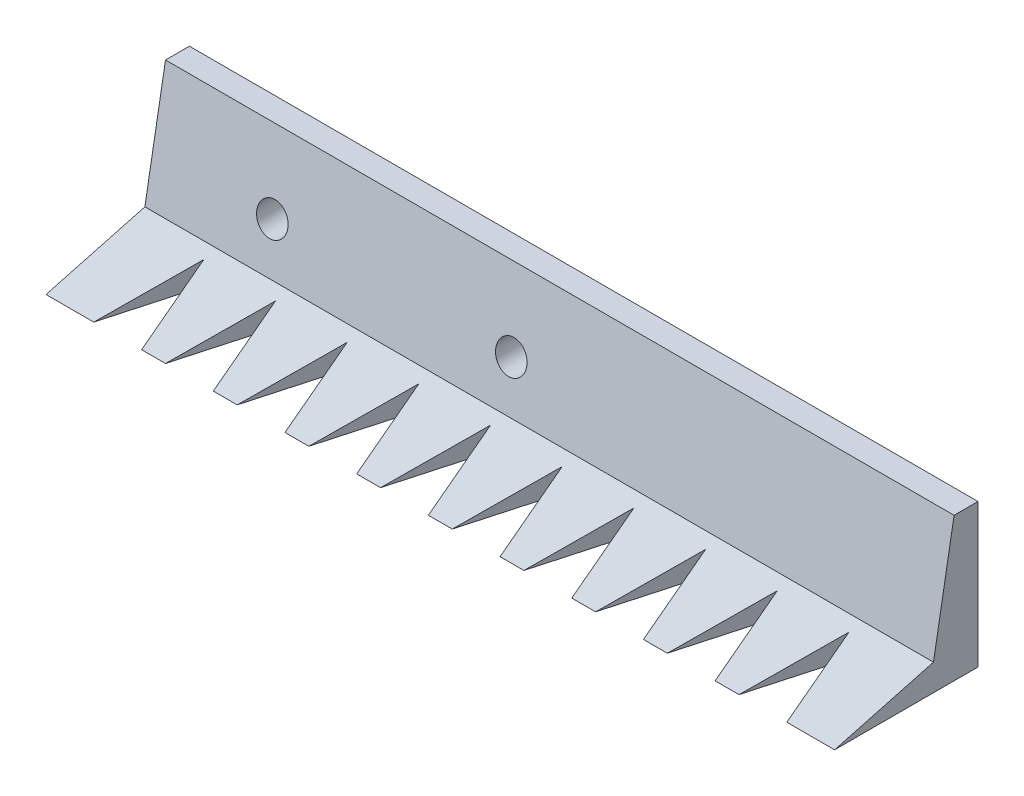
ISO-10303-21;
HEADER;
FILE_DESCRIPTION(('STEP AP214'),'2;1');
FILE_NAME('part.step','',(''),(''),'','','');
FILE_SCHEMA(('AUTOMOTIVE_DESIGN { 1 0 10303 214 1 1 1 1 }'));
ENDSEC;
DATA;
#1=APPLICATION_CONTEXT('core data for automotive mechanical design processes');
#2=APPLICATION_PROTOCOL_DEFINITION('international standard','automotive_design',2000,#1);
#3=PRODUCT_CONTEXT('',#1,'mechanical');
#4=PRODUCT('Part','Part','',(#3));
#5=PRODUCT_RELATED_PRODUCT_CATEGORY('part','',(#4));
#6=PRODUCT_DEFINITION_FORMATION('','',#4);
#7=PRODUCT_DEFINITION_CONTEXT('part definition',#1,'design');
#8=PRODUCT_DEFINITION('design','',#6,#7);
#9=PRODUCT_DEFINITION_SHAPE('','',#8);
#10=(LENGTH_UNIT() NAMED_UNIT(*) SI_UNIT(.MILLI.,.METRE.));
#11=(NAMED_UNIT(*) PLANE_ANGLE_UNIT() SI_UNIT($,.RADIAN.));
#12=(NAMED_UNIT(*) SI_UNIT($,.STERADIAN.) SOLID_ANGLE_UNIT());
#13=UNCERTAINTY_MEASURE_WITH_UNIT(LENGTH_MEASURE(1.E-05),#10,'distance_accuracy_value','');
#14=(GEOMETRIC_REPRESENTATION_CONTEXT(3) GLOBAL_UNCERTAINTY_ASSIGNED_CONTEXT((#13)) GLOBAL_UNIT_ASSIGNED_CONTEXT((#10,
#11,#12)) REPRESENTATION_CONTEXT('',''));
#15=CARTESIAN_POINT('',(0.,0.,0.));
#16=DIRECTION('',(0.,0.,1.));
#17=DIRECTION('',(1.,0.,0.));
#18=AXIS2_PLACEMENT_3D('',#15,#16,#17);
#19=CARTESIAN_POINT('',(100.,0.,30.));
#20=DIRECTION('',(0.,1.,0.));
#21=DIRECTION('',(0.,0.,1.));
#22=AXIS2_PLACEMENT_3D('',#19,#20,#21);
#23=PLANE('',#22);
#24=DIRECTION('',(0.267643863786095,0.,0.963517909629941));
#25=VECTOR('',#24,1.);
#26=CARTESIAN_POINT('',(39.6561604584527,0.,46.7621776504298));
#27=LINE('',#26,#25);
#28=CARTESIAN_POINT('',(30.,0.,12.));
#29=VERTEX_POINT('',#28);
#30=CARTESIAN_POINT('',(35.,0.,30.));
#31=VERTEX_POINT('',#30);
#32=EDGE_CURVE('E266',#29,#31,#27,.T.);
#33=ORIENTED_EDGE('',*,*,#32,.F.);
#34=DIRECTION('',(0.267643863786095,0.,-0.963517909629941));
#35=VECTOR('',#34,1.);
#36=CARTESIAN_POINT('',(30.3724928366762,0.,10.6590257879656));
#37=LINE('',#36,#35);
#38=CARTESIAN_POINT('',(25.,0.,30.));
#39=VERTEX_POINT('',#38);
#40=EDGE_CURVE('E264',#39,#29,#37,.T.);
#41=ORIENTED_EDGE('',*,*,#40,.F.);
#42=DIRECTION('',(-1.,0.,0.));
#43=VECTOR('',#42,1.);
#44=CARTESIAN_POINT('',(100.,0.,30.));
#45=LINE('',#44,#43);
#46=CARTESIAN_POINT('',(20.,0.,30.));
#47=VERTEX_POINT('',#46);
#48=EDGE_CURVE('E320',#39,#47,#45,.T.);
#49=ORIENTED_EDGE('',*,*,#48,.T.);
#50=DIRECTION('',(0.267643863786095,0.,0.963517909629941));
#51=VECTOR('',#50,1.);
#52=CARTESIAN_POINT('',(25.730659025788,0.,50.6303724928367));
#53=LINE('',#52,#51);
#54=CARTESIAN_POINT('',(15.,0.,12.));
#55=VERTEX_POINT('',#54);
#56=EDGE_CURVE('E273',#55,#47,#53,.T.);
#57=ORIENTED_EDGE('',*,*,#56,.F.);
#58=DIRECTION('',(0.267643863786095,0.,-0.963517909629941));
#59=VECTOR('',#58,1.);
#60=CARTESIAN_POINT('',(16.4469914040114,0.,6.79083094555874));
#61=LINE('',#60,#59);
#62=CARTESIAN_POINT('',(10.,0.,30.));
#63=VERTEX_POINT('',#62);
#64=EDGE_CURVE('E271',#63,#55,#61,.T.);
#65=ORIENTED_EDGE('',*,*,#64,.F.);
#66=CARTESIAN_POINT('',(0.,0.,30.));
#67=VERTEX_POINT('',#66);
#68=EDGE_CURVE('E316',#63,#67,#45,.T.);
#69=ORIENTED_EDGE('',*,*,#68,.T.);
#70=DIRECTION('',(0.,0.,-1.));
#71=VECTOR('',#70,1.);
#72=CARTESIAN_POINT('',(0.,0.,30.));
#73=LINE('',#72,#71);
#74=CARTESIAN_POINT('',(0.,0.,0.));
#75=VERTEX_POINT('',#74);
#76=EDGE_CURVE('E304',#67,#75,#73,.T.);
#77=ORIENTED_EDGE('',*,*,#76,.T.);
#78=DIRECTION('',(-1.,0.,0.));
#79=VECTOR('',#78,1.);
#80=CARTESIAN_POINT('',(100.,0.,0.));
#81=LINE('',#80,#79);
#82=CARTESIAN_POINT('',(165.,0.,0.));
#83=VERTEX_POINT('',#82);
#84=EDGE_CURVE('E329',#83,#75,#81,.T.);
#85=ORIENTED_EDGE('',*,*,#84,.F.);
#86=DIRECTION('',(0.,0.,1.));
#87=VECTOR('',#86,1.);
#88=CARTESIAN_POINT('',(165.,0.,0.));
#89=LINE('',#88,#87);
#90=CARTESIAN_POINT('',(165.,0.,30.));
#91=VERTEX_POINT('',#90);
#92=EDGE_CURVE('E279',#83,#91,#89,.T.);
#93=ORIENTED_EDGE('',*,*,#92,.T.);
#94=CARTESIAN_POINT('',(155.,0.,30.));
#95=VERTEX_POINT('',#94);
#96=EDGE_CURVE('E233',#91,#95,#45,.T.);
#97=ORIENTED_EDGE('',*,*,#96,.T.);
#98=DIRECTION('',(0.267643863786095,0.,0.963517909629941));
#99=VECTOR('',#98,1.);
#100=CARTESIAN_POINT('',(151.060171919771,0.,15.8166189111748));
#101=LINE('',#100,#99);
#102=CARTESIAN_POINT('',(150.,0.,12.));
#103=VERTEX_POINT('',#102);
#104=EDGE_CURVE('E222',#103,#95,#101,.T.);
#105=ORIENTED_EDGE('',*,*,#104,.F.);
#106=DIRECTION('',(0.267643863786095,0.,-0.963517909629941));
#107=VECTOR('',#106,1.);
#108=CARTESIAN_POINT('',(141.776504297994,0.,41.6045845272206));
#109=LINE('',#108,#107);
#110=CARTESIAN_POINT('',(145.,0.,30.));
#111=VERTEX_POINT('',#110);
#112=EDGE_CURVE('E211',#111,#103,#109,.T.);
#113=ORIENTED_EDGE('',*,*,#112,.F.);
#114=CARTESIAN_POINT('',(140.,0.,30.));
#115=VERTEX_POINT('',#114);
#116=EDGE_CURVE('E319',#111,#115,#45,.T.);
#117=ORIENTED_EDGE('',*,*,#116,.T.);
#118=DIRECTION('',(0.267643863786095,0.,0.963517909629941));
#119=VECTOR('',#118,1.);
#120=CARTESIAN_POINT('',(137.134670487106,0.,19.6848137535817));
#121=LINE('',#120,#119);
#122=CARTESIAN_POINT('',(135.,0.,12.));
#123=VERTEX_POINT('',#122);
#124=EDGE_CURVE('E236',#123,#115,#121,.T.);
#125=ORIENTED_EDGE('',*,*,#124,.F.);
#126=DIRECTION('',(0.267643863786095,0.,-0.963517909629941));
#127=VECTOR('',#126,1.);
#128=CARTESIAN_POINT('',(127.85100286533,0.,37.7363896848138));
#129=LINE('',#128,#127);
#130=CARTESIAN_POINT('',(130.,0.,30.));
#131=VERTEX_POINT('',#130);
#132=EDGE_CURVE('E234',#131,#123,#129,.T.);
#133=ORIENTED_EDGE('',*,*,#132,.F.);
#134=CARTESIAN_POINT('',(125.,0.,30.));
#135=VERTEX_POINT('',#134);
#136=EDGE_CURVE('E397',#131,#135,#45,.T.);
#137=ORIENTED_EDGE('',*,*,#136,.T.);
#138=DIRECTION('',(0.267643863786095,0.,0.963517909629941));
#139=VECTOR('',#138,1.);
#140=CARTESIAN_POINT('',(123.209169054441,0.,23.5530085959885));
#141=LINE('',#140,#139);
#142=CARTESIAN_POINT('',(120.,0.,12.));
#143=VERTEX_POINT('',#142);
#144=EDGE_CURVE('E242',#143,#135,#141,.T.);
#145=ORIENTED_EDGE('',*,*,#144,.F.);
#146=DIRECTION('',(0.267643863786095,0.,-0.963517909629941));
#147=VECTOR('',#146,1.);
#148=CARTESIAN_POINT('',(113.925501432665,0.,33.8681948424069));
#149=LINE('',#148,#147);
#150=CARTESIAN_POINT('',(115.,0.,30.));
#151=VERTEX_POINT('',#150);
#152=EDGE_CURVE('E240',#151,#143,#149,.T.);
#153=ORIENTED_EDGE('',*,*,#152,.F.);
#154=CARTESIAN_POINT('',(110.,0.,30.));
#155=VERTEX_POINT('',#154);
#156=EDGE_CURVE('E400',#151,#155,#45,.T.);
#157=ORIENTED_EDGE('',*,*,#156,.T.);
#158=DIRECTION('',(0.267643863786095,0.,0.963517909629941));
#159=VECTOR('',#158,1.);
#160=CARTESIAN_POINT('',(109.283667621776,0.,27.4212034383954));
#161=LINE('',#160,#159);
#162=CARTESIAN_POINT('',(105.,0.,12.));
#163=VERTEX_POINT('',#162);
#164=EDGE_CURVE('E246',#163,#155,#161,.T.);
#165=ORIENTED_EDGE('',*,*,#164,.F.);
#166=DIRECTION('',(0.267643863786095,0.,-0.963517909629941));
#167=VECTOR('',#166,1.);
#168=CARTESIAN_POINT('',(100.,0.,30.));
#169=LINE('',#168,#167);
#170=CARTESIAN_POINT('',(100.,0.,30.));
#171=VERTEX_POINT('',#170);
#172=EDGE_CURVE('E244',#171,#163,#169,.T.);
#173=ORIENTED_EDGE('',*,*,#172,.F.);
#174=CARTESIAN_POINT('',(95.,0.,30.));
#175=VERTEX_POINT('',#174);
#176=EDGE_CURVE('E405',#171,#175,#45,.T.);
#177=ORIENTED_EDGE('',*,*,#176,.T.);
#178=DIRECTION('',(0.267643863786095,0.,0.963517909629941));
#179=VECTOR('',#178,1.);
#180=CARTESIAN_POINT('',(95.3581661891117,0.,31.2893982808023));
#181=LINE('',#180,#179);
#182=CARTESIAN_POINT('',(90.,0.,12.));
#183=VERTEX_POINT('',#182);
#184=EDGE_CURVE('E250',#183,#175,#181,.T.);
#185=ORIENTED_EDGE('',*,*,#184,.F.);
#186=DIRECTION('',(0.267643863786095,0.,-0.963517909629941));
#187=VECTOR('',#186,1.);
#188=CARTESIAN_POINT('',(86.0744985673352,0.,26.1318051575931));
#189=LINE('',#188,#187);
#190=CARTESIAN_POINT('',(85.,0.,30.));
#191=VERTEX_POINT('',#190);
#192=EDGE_CURVE('E248',#191,#183,#189,.T.);
#193=ORIENTED_EDGE('',*,*,#192,.F.);
#194=CARTESIAN_POINT('',(80.,0.,30.));
#195=VERTEX_POINT('',#194);
#196=EDGE_CURVE('E410',#191,#195,#45,.T.);
#197=ORIENTED_EDGE('',*,*,#196,.T.);
#198=DIRECTION('',(0.267643863786095,0.,0.963517909629941));
#199=VECTOR('',#198,1.);
#200=CARTESIAN_POINT('',(81.432664756447,0.,35.1575931232092));
#201=LINE('',#200,#199);
#202=CARTESIAN_POINT('',(75.,0.,12.));
#203=VERTEX_POINT('',#202);
#204=EDGE_CURVE('E254',#203,#195,#201,.T.);
#205=ORIENTED_EDGE('',*,*,#204,.F.);
#206=DIRECTION('',(0.267643863786095,0.,-0.963517909629941));
#207=VECTOR('',#206,1.);
#208=CARTESIAN_POINT('',(72.1489971346705,0.,22.2636103151862));
#209=LINE('',#208,#207);
#210=CARTESIAN_POINT('',(70.,0.,30.));
#211=VERTEX_POINT('',#210);
#212=EDGE_CURVE('E252',#211,#203,#209,.T.);
#213=ORIENTED_EDGE('',*,*,#212,.F.);
#214=CARTESIAN_POINT('',(65.,0.,30.));
#215=VERTEX_POINT('',#214);
#216=EDGE_CURVE('E415',#211,#215,#45,.T.);
#217=ORIENTED_EDGE('',*,*,#216,.T.);
#218=DIRECTION('',(0.267643863786095,0.,0.963517909629941));
#219=VECTOR('',#218,1.);
#220=CARTESIAN_POINT('',(67.5071633237822,0.,39.025787965616));
#221=LINE('',#220,#219);
#222=CARTESIAN_POINT('',(60.,0.,12.));
#223=VERTEX_POINT('',#222);
#224=EDGE_CURVE('E258',#223,#215,#221,.T.);
#225=ORIENTED_EDGE('',*,*,#224,.F.);
#226=DIRECTION('',(0.267643863786095,0.,-0.963517909629941));
#227=VECTOR('',#226,1.);
#228=CARTESIAN_POINT('',(58.2234957020057,0.,18.3954154727794));
#229=LINE('',#228,#227);
#230=CARTESIAN_POINT('',(55.,0.,30.));
#231=VERTEX_POINT('',#230);
#232=EDGE_CURVE('E256',#231,#223,#229,.T.);
#233=ORIENTED_EDGE('',*,*,#232,.F.);
#234=CARTESIAN_POINT('',(50.,0.,30.));
#235=VERTEX_POINT('',#234);
#236=EDGE_CURVE('E394',#231,#235,#45,.T.);
#237=ORIENTED_EDGE('',*,*,#236,.T.);
#238=DIRECTION('',(0.267643863786095,0.,0.963517909629941));
#239=VECTOR('',#238,1.);
#240=CARTESIAN_POINT('',(53.5816618911175,0.,42.8939828080229));
#241=LINE('',#240,#239);
#242=CARTESIAN_POINT('',(45.,0.,12.));
#243=VERTEX_POINT('',#242);
#244=EDGE_CURVE('E262',#243,#235,#241,.T.);
#245=ORIENTED_EDGE('',*,*,#244,.F.);
#246=DIRECTION('',(0.267643863786095,0.,-0.963517909629941));
#247=VECTOR('',#246,1.);
#248=CARTESIAN_POINT('',(44.297994269341,0.,14.5272206303725));
#249=LINE('',#248,#247);
#250=CARTESIAN_POINT('',(40.,0.,30.));
#251=VERTEX_POINT('',#250);
#252=EDGE_CURVE('E260',#251,#243,#249,.T.);
#253=ORIENTED_EDGE('',*,*,#252,.F.);
#254=EDGE_CURVE('E393',#251,#31,#45,.T.);
#255=ORIENTED_EDGE('',*,*,#254,.T.);
#256=EDGE_LOOP('',(#33,#41,#49,#57,#65,#69,#77,#85,#93,#97,#105,#113,#117,#125,#133,#137,#145,
#153,#157,#165,#173,#177,#185,#193,#197,#205,#213,#217,#225,#233,#237,#245,#253,#255));
#257=FACE_BOUND('',#256,.T.);
#258=ADVANCED_FACE('F47',(#257),#23,.F.);
#259=CARTESIAN_POINT('',(100.,0.,30.));
#260=DIRECTION('',(0.,-0.965925826289068,-0.258819045102522));
#261=DIRECTION('',(0.,0.258819045102522,-0.965925826289068));
#262=AXIS2_PLACEMENT_3D('',#259,#260,#261);
#263=PLANE('',#262);
#264=DIRECTION('',(-0.259146627711523,0.249977266619586,-0.932927859761485));
#265=VECTOR('',#264,1.);
#266=CARTESIAN_POINT('',(39.3652033525266,-4.21074976718566,45.7147320690957));
#267=LINE('',#266,#265);
#268=CARTESIAN_POINT('',(30.,4.82308546376022,12.));
#269=VERTEX_POINT('',#268);
#270=EDGE_CURVE('E11',#31,#269,#267,.T.);
#271=ORIENTED_EDGE('',*,*,#270,.F.);
#272=ORIENTED_EDGE('',*,*,#254,.F.);
#273=DIRECTION('',(-0.259146627711524,-0.249977266619586,0.932927859761485));
#274=VECTOR('',#273,1.);
#275=CARTESIAN_POINT('',(44.0294184792553,3.88684593894061,15.4940934746809));
#276=LINE('',#275,#274);
#277=CARTESIAN_POINT('',(45.,4.82308546376022,12.));
#278=VERTEX_POINT('',#277);
#279=EDGE_CURVE('E379',#278,#251,#276,.T.);
#280=ORIENTED_EDGE('',*,*,#279,.F.);
#281=DIRECTION('',(-0.259146627711523,0.249977266619586,-0.932927859761485));
#282=VECTOR('',#281,1.);
#283=CARTESIAN_POINT('',(53.3578487327128,-3.23903828245051,42.0882554377659));
#284=LINE('',#283,#282);
#285=EDGE_CURVE('E381',#235,#278,#284,.T.);
#286=ORIENTED_EDGE('',*,*,#285,.F.);
#287=ORIENTED_EDGE('',*,*,#236,.F.);
#288=DIRECTION('',(-0.259146627711524,-0.249977266619586,0.932927859761485));
#289=VECTOR('',#288,1.);
#290=CARTESIAN_POINT('',(58.0220638594415,2.91513445420546,19.1205701060107));
#291=LINE('',#290,#289);
#292=CARTESIAN_POINT('',(60.,4.82308546376023,12.));
#293=VERTEX_POINT('',#292);
#294=EDGE_CURVE('E374',#293,#231,#291,.T.);
#295=ORIENTED_EDGE('',*,*,#294,.F.);
#296=DIRECTION('',(-0.259146627711523,0.249977266619586,-0.932927859761485));
#297=VECTOR('',#296,1.);
#298=CARTESIAN_POINT('',(67.3504941128989,-2.26732679771536,38.4617788064361));
#299=LINE('',#298,#297);
#300=EDGE_CURVE('E376',#215,#293,#299,.T.);
#301=ORIENTED_EDGE('',*,*,#300,.F.);
#302=ORIENTED_EDGE('',*,*,#216,.F.);
#303=DIRECTION('',(-0.259146627711524,-0.249977266619586,0.932927859761485));
#304=VECTOR('',#303,1.);
#305=CARTESIAN_POINT('',(72.0147092396276,1.94342296947031,22.7470467373405));
#306=LINE('',#305,#304);
#307=CARTESIAN_POINT('',(75.,4.82308546376022,12.));
#308=VERTEX_POINT('',#307);
#309=EDGE_CURVE('E369',#308,#211,#306,.T.);
#310=ORIENTED_EDGE('',*,*,#309,.F.);
#311=DIRECTION('',(-0.259146627711523,0.249977266619586,-0.932927859761485));
#312=VECTOR('',#311,1.);
#313=CARTESIAN_POINT('',(81.3431394930851,-1.29561531298021,34.8353021751064));
#314=LINE('',#313,#312);
#315=EDGE_CURVE('E371',#195,#308,#314,.T.);
#316=ORIENTED_EDGE('',*,*,#315,.F.);
#317=ORIENTED_EDGE('',*,*,#196,.F.);
#318=DIRECTION('',(-0.259146627711524,-0.249977266619586,0.932927859761485));
#319=VECTOR('',#318,1.);
#320=CARTESIAN_POINT('',(86.0073546198138,0.971711484735154,26.3735233686702));
#321=LINE('',#320,#319);
#322=CARTESIAN_POINT('',(90.,4.82308546376022,12.));
#323=VERTEX_POINT('',#322);
#324=EDGE_CURVE('E364',#323,#191,#321,.T.);
#325=ORIENTED_EDGE('',*,*,#324,.F.);
#326=DIRECTION('',(-0.259146627711523,0.249977266619586,-0.932927859761485));
#327=VECTOR('',#326,1.);
#328=CARTESIAN_POINT('',(95.3357848732713,-0.323903828245052,31.2088255437766));
#329=LINE('',#328,#327);
#330=EDGE_CURVE('E366',#175,#323,#329,.T.);
#331=ORIENTED_EDGE('',*,*,#330,.F.);
#332=ORIENTED_EDGE('',*,*,#176,.F.);
#333=DIRECTION('',(-0.259146627711524,-0.249977266619586,0.932927859761485));
#334=VECTOR('',#333,1.);
#335=CARTESIAN_POINT('',(100.,0.,30.));
#336=LINE('',#335,#334);
#337=CARTESIAN_POINT('',(105.,4.82308546376022,12.));
#338=VERTEX_POINT('',#337);
#339=EDGE_CURVE('E359',#338,#171,#336,.T.);
#340=ORIENTED_EDGE('',*,*,#339,.F.);
#341=DIRECTION('',(-0.259146627711523,0.249977266619586,-0.932927859761485));
#342=VECTOR('',#341,1.);
#343=CARTESIAN_POINT('',(109.328430253457,0.647807656490101,27.5823489124468));
#344=LINE('',#343,#342);
#345=EDGE_CURVE('E361',#155,#338,#344,.T.);
#346=ORIENTED_EDGE('',*,*,#345,.F.);
#347=ORIENTED_EDGE('',*,*,#156,.F.);
#348=DIRECTION('',(-0.259146627711524,-0.249977266619586,0.932927859761485));
#349=VECTOR('',#348,1.);
#350=CARTESIAN_POINT('',(113.992645380186,-0.971711484735153,33.6264766313298));
#351=LINE('',#350,#349);
#352=CARTESIAN_POINT('',(120.,4.82308546376022,12.));
#353=VERTEX_POINT('',#352);
#354=EDGE_CURVE('E354',#353,#151,#351,.T.);
#355=ORIENTED_EDGE('',*,*,#354,.F.);
#356=DIRECTION('',(-0.259146627711523,0.249977266619586,-0.932927859761485));
#357=VECTOR('',#356,1.);
#358=CARTESIAN_POINT('',(123.321075633644,1.61951914122525,23.9558722811171));
#359=LINE('',#358,#357);
#360=EDGE_CURVE('E356',#135,#353,#359,.T.);
#361=ORIENTED_EDGE('',*,*,#360,.F.);
#362=ORIENTED_EDGE('',*,*,#136,.F.);
#363=DIRECTION('',(-0.259146627711524,-0.249977266619586,0.932927859761485));
#364=VECTOR('',#363,1.);
#365=CARTESIAN_POINT('',(127.985290760372,-1.94342296947031,37.2529532626595));
#366=LINE('',#365,#364);
#367=CARTESIAN_POINT('',(135.,4.82308546376022,12.));
#368=VERTEX_POINT('',#367);
#369=EDGE_CURVE('E349',#368,#131,#366,.T.);
#370=ORIENTED_EDGE('',*,*,#369,.F.);
#371=DIRECTION('',(-0.259146627711523,0.249977266619586,-0.932927859761485));
#372=VECTOR('',#371,1.);
#373=CARTESIAN_POINT('',(137.31372101383,2.59123062596041,20.3293956497873));
#374=LINE('',#373,#372);
#375=EDGE_CURVE('E351',#115,#368,#374,.T.);
#376=ORIENTED_EDGE('',*,*,#375,.F.);
#377=ORIENTED_EDGE('',*,*,#116,.F.);
#378=DIRECTION('',(-0.259146627711524,-0.249977266619586,0.932927859761485));
#379=VECTOR('',#378,1.);
#380=CARTESIAN_POINT('',(141.977936140559,-2.91513445420546,40.8794298939893));
#381=LINE('',#380,#379);
#382=CARTESIAN_POINT('',(150.,4.82308546376022,12.));
#383=VERTEX_POINT('',#382);
#384=EDGE_CURVE('E217',#383,#111,#381,.T.);
#385=ORIENTED_EDGE('',*,*,#384,.F.);
#386=DIRECTION('',(-0.259146627711523,0.249977266619586,-0.932927859761485));
#387=VECTOR('',#386,1.);
#388=CARTESIAN_POINT('',(151.306366394016,3.56294211069556,16.7029190184575));
#389=LINE('',#388,#387);
#390=EDGE_CURVE('E227',#95,#383,#389,.T.);
#391=ORIENTED_EDGE('',*,*,#390,.F.);
#392=ORIENTED_EDGE('',*,*,#96,.F.);
#393=DIRECTION('',(0.,0.258819045102522,-0.965925826289068));
#394=VECTOR('',#393,1.);
#395=CARTESIAN_POINT('',(165.,0.,30.));
#396=LINE('',#395,#394);
#397=CARTESIAN_POINT('',(165.,5.5432287597402,9.31238863067264));
#398=VERTEX_POINT('',#397);
#399=EDGE_CURVE('E281',#91,#398,#396,.T.);
#400=ORIENTED_EDGE('',*,*,#399,.T.);
#401=DIRECTION('',(-1.,0.,0.));
#402=VECTOR('',#401,1.);
#403=CARTESIAN_POINT('',(100.,5.5432287597402,9.31238863067264));
#404=LINE('',#403,#402);
#405=CARTESIAN_POINT('',(0.,5.5432287597402,9.31238863067264));
#406=VERTEX_POINT('',#405);
#407=EDGE_CURVE('E318',#398,#406,#404,.T.);
#408=ORIENTED_EDGE('',*,*,#407,.T.);
#409=DIRECTION('',(0.,-0.258819045102522,0.965925826289068));
#410=VECTOR('',#409,1.);
#411=CARTESIAN_POINT('',(0.,0.,30.));
#412=LINE('',#411,#410);
#413=EDGE_CURVE('E313',#406,#67,#412,.T.);
#414=ORIENTED_EDGE('',*,*,#413,.T.);
#415=ORIENTED_EDGE('',*,*,#68,.F.);
#416=DIRECTION('',(-0.259146627711524,-0.249977266619586,0.932927859761485));
#417=VECTOR('',#416,1.);
#418=CARTESIAN_POINT('',(16.0441277188829,5.83026890841092,8.24114021202138));
#419=LINE('',#418,#417);
#420=CARTESIAN_POINT('',(15.,4.82308546376023,12.));
#421=VERTEX_POINT('',#420);
#422=EDGE_CURVE('E332',#421,#63,#419,.T.);
#423=ORIENTED_EDGE('',*,*,#422,.F.);
#424=DIRECTION('',(-0.259146627711523,0.249977266619586,-0.932927859761485));
#425=VECTOR('',#424,1.);
#426=CARTESIAN_POINT('',(25.3725579723404,-5.18246125192082,49.3412087004254));
#427=LINE('',#426,#425);
#428=EDGE_CURVE('E344',#47,#421,#427,.T.);
#429=ORIENTED_EDGE('',*,*,#428,.F.);
#430=ORIENTED_EDGE('',*,*,#48,.F.);
#431=DIRECTION('',(-0.259146627711524,-0.249977266619586,0.932927859761485));
#432=VECTOR('',#431,1.);
#433=CARTESIAN_POINT('',(30.0367730990691,4.85855742367577,11.8676168433511));
#434=LINE('',#433,#432);
#435=EDGE_CURVE('E54',#269,#39,#434,.T.);
#436=ORIENTED_EDGE('',*,*,#435,.F.);
#437=EDGE_LOOP('',(#271,#272,#280,#286,#287,#295,#301,#302,#310,#316,#317,#325,#331,#332,#340,
#346,#347,#355,#361,#362,#370,#376,#377,#385,#391,#392,#400,#408,#414,#415,#423,#429,#430,#436));
#438=FACE_BOUND('',#437,.T.);
#439=ADVANCED_FACE('F391',(#438),#263,.F.);
#440=CARTESIAN_POINT('',(100.,0.,0.));
#441=DIRECTION('',(0.,0.,1.));
#442=DIRECTION('',(1.,0.,0.));
#443=AXIS2_PLACEMENT_3D('',#440,#441,#442);
#444=PLANE('',#443);
#445=CARTESIAN_POINT('',(75.,15.,0.));
#446=DIRECTION('',(0.,0.,-1.));
#447=DIRECTION('',(-1.,0.,0.));
#448=AXIS2_PLACEMENT_3D('',#445,#446,#447);
#449=CIRCLE('',#448,1.69999999999999);
#450=CARTESIAN_POINT('',(73.3,15.,0.));
#451=VERTEX_POINT('',#450);
#452=EDGE_CURVE('E297',#451,#451,#449,.T.);
#453=ORIENTED_EDGE('',*,*,#452,.F.);
#454=EDGE_LOOP('',(#453));
#455=FACE_BOUND('',#454,.T.);
#456=CARTESIAN_POINT('',(25.,15.,0.));
#457=DIRECTION('',(0.,0.,-1.));
#458=DIRECTION('',(-1.,0.,0.));
#459=AXIS2_PLACEMENT_3D('',#456,#457,#458);
#460=CIRCLE('',#459,1.7);
#461=CARTESIAN_POINT('',(23.3,15.,0.));
#462=VERTEX_POINT('',#461);
#463=EDGE_CURVE('E300',#462,#462,#460,.T.);
#464=ORIENTED_EDGE('',*,*,#463,.F.);
#465=EDGE_LOOP('',(#464));
#466=FACE_BOUND('',#465,.T.);
#467=DIRECTION('',(0.,1.,0.));
#468=VECTOR('',#467,1.);
#469=CARTESIAN_POINT('',(0.,0.,0.));
#470=LINE('',#469,#468);
#471=CARTESIAN_POINT('',(0.,30.,0.));
#472=VERTEX_POINT('',#471);
#473=EDGE_CURVE('E307',#75,#472,#470,.T.);
#474=ORIENTED_EDGE('',*,*,#473,.T.);
#475=DIRECTION('',(-1.,0.,0.));
#476=VECTOR('',#475,1.);
#477=CARTESIAN_POINT('',(100.,30.,0.));
#478=LINE('',#477,#476);
#479=CARTESIAN_POINT('',(165.,30.,0.));
#480=VERTEX_POINT('',#479);
#481=EDGE_CURVE('E326',#480,#472,#478,.T.);
#482=ORIENTED_EDGE('',*,*,#481,.F.);
#483=DIRECTION('',(0.,-1.,0.));
#484=VECTOR('',#483,1.);
#485=CARTESIAN_POINT('',(165.,30.,0.));
#486=LINE('',#485,#484);
#487=EDGE_CURVE('E276',#480,#83,#486,.T.);
#488=ORIENTED_EDGE('',*,*,#487,.T.);
#489=ORIENTED_EDGE('',*,*,#84,.T.);
#490=EDGE_LOOP('',(#474,#482,#488,#489));
#491=FACE_BOUND('',#490,.T.);
#492=ADVANCED_FACE('F498',(#455,#466,#491),#444,.F.);
#493=CARTESIAN_POINT('',(100.,30.,5.));
#494=DIRECTION('',(0.,-1.,0.));
#495=DIRECTION('',(0.,0.,-1.));
#496=AXIS2_PLACEMENT_3D('',#493,#494,#495);
#497=PLANE('',#496);
#498=DIRECTION('',(0.,0.,1.));
#499=VECTOR('',#498,1.);
#500=CARTESIAN_POINT('',(0.,30.,5.));
#501=LINE('',#500,#499);
#502=CARTESIAN_POINT('',(0.,30.,5.));
#503=VERTEX_POINT('',#502);
#504=EDGE_CURVE('E309',#472,#503,#501,.T.);
#505=ORIENTED_EDGE('',*,*,#504,.T.);
#506=DIRECTION('',(-1.,0.,0.));
#507=VECTOR('',#506,1.);
#508=CARTESIAN_POINT('',(100.,30.,5.));
#509=LINE('',#508,#507);
#510=CARTESIAN_POINT('',(165.,30.,5.));
#511=VERTEX_POINT('',#510);
#512=EDGE_CURVE('E323',#511,#503,#509,.T.);
#513=ORIENTED_EDGE('',*,*,#512,.F.);
#514=DIRECTION('',(0.,0.,-1.));
#515=VECTOR('',#514,1.);
#516=CARTESIAN_POINT('',(165.,30.,5.));
#517=LINE('',#516,#515);
#518=EDGE_CURVE('E287',#511,#480,#517,.T.);
#519=ORIENTED_EDGE('',*,*,#518,.T.);
#520=ORIENTED_EDGE('',*,*,#481,.T.);
#521=EDGE_LOOP('',(#505,#513,#519,#520));
#522=FACE_BOUND('',#521,.T.);
#523=ADVANCED_FACE('F504',(#522),#497,.F.);
#524=CARTESIAN_POINT('',(100.,5.5432287597402,9.31238863067264));
#525=DIRECTION('',(0.,-0.173648177666931,-0.984807753012208));
#526=DIRECTION('',(0.,0.984807753012208,-0.173648177666931));
#527=AXIS2_PLACEMENT_3D('',#524,#525,#526);
#528=PLANE('',#527);
#529=CARTESIAN_POINT('',(75.,15.,7.64490471062698));
#530=DIRECTION('',(0.,-0.173648177666931,-0.984807753012208));
#531=DIRECTION('',(0.,0.984807753012208,-0.173648177666931));
#532=AXIS2_PLACEMENT_3D('',#529,#530,#531);
#533=ELLIPSE('',#532,3.30013648862868,3.25000000000001);
#534=CARTESIAN_POINT('',(75.,18.25,7.07184202332447));
#535=VERTEX_POINT('',#534);
#536=EDGE_CURVE('E301',#535,#535,#533,.T.);
#537=ORIENTED_EDGE('',*,*,#536,.T.);
#538=EDGE_LOOP('',(#537));
#539=FACE_BOUND('',#538,.T.);
#540=CARTESIAN_POINT('',(25.,15.,7.64490471062698));
#541=DIRECTION('',(0.,-0.173648177666931,-0.984807753012208));
#542=DIRECTION('',(0.,0.984807753012208,-0.173648177666931));
#543=AXIS2_PLACEMENT_3D('',#540,#541,#542);
#544=ELLIPSE('',#543,3.30013648862867,3.25);
#545=CARTESIAN_POINT('',(25.,18.25,7.07184202332447));
#546=VERTEX_POINT('',#545);
#547=EDGE_CURVE('E338',#546,#546,#544,.T.);
#548=ORIENTED_EDGE('',*,*,#547,.T.);
#549=EDGE_LOOP('',(#548));
#550=FACE_BOUND('',#549,.T.);
#551=DIRECTION('',(0.,-0.984807753012208,0.173648177666931));
#552=VECTOR('',#551,1.);
#553=CARTESIAN_POINT('',(0.,5.5432287597402,9.31238863067264));
#554=LINE('',#553,#552);
#555=EDGE_CURVE('E311',#503,#406,#554,.T.);
#556=ORIENTED_EDGE('',*,*,#555,.T.);
#557=ORIENTED_EDGE('',*,*,#407,.F.);
#558=DIRECTION('',(0.,0.984807753012208,-0.173648177666931));
#559=VECTOR('',#558,1.);
#560=CARTESIAN_POINT('',(165.,5.5432287597402,9.31238863067264));
#561=LINE('',#560,#559);
#562=EDGE_CURVE('E284',#398,#511,#561,.T.);
#563=ORIENTED_EDGE('',*,*,#562,.T.);
#564=ORIENTED_EDGE('',*,*,#512,.T.);
#565=EDGE_LOOP('',(#556,#557,#563,#564));
#566=FACE_BOUND('',#565,.T.);
#567=ADVANCED_FACE('F510',(#539,#550,#566),#528,.F.);
#568=CARTESIAN_POINT('',(0.,0.,0.));
#569=DIRECTION('',(1.,0.,0.));
#570=DIRECTION('',(0.,0.,-1.));
#571=AXIS2_PLACEMENT_3D('',#568,#569,#570);
#572=PLANE('',#571);
#573=ORIENTED_EDGE('',*,*,#76,.F.);
#574=ORIENTED_EDGE('',*,*,#413,.F.);
#575=ORIENTED_EDGE('',*,*,#555,.F.);
#576=ORIENTED_EDGE('',*,*,#504,.F.);
#577=ORIENTED_EDGE('',*,*,#473,.F.);
#578=EDGE_LOOP('',(#573,#574,#575,#576,#577));
#579=FACE_BOUND('',#578,.T.);
#580=ADVANCED_FACE('F508',(#579),#572,.F.);
#581=CARTESIAN_POINT('',(25.,15.,0.));
#582=DIRECTION('',(0.,0.,-1.));
#583=DIRECTION('',(-1.,0.,0.));
#584=AXIS2_PLACEMENT_3D('',#581,#582,#583);
#585=CYLINDRICAL_SURFACE('',#584,1.69999999999999);
#586=CARTESIAN_POINT('',(25.,15.,2.5));
#587=DIRECTION('',(0.,0.,-1.));
#588=DIRECTION('',(-1.,0.,0.));
#589=AXIS2_PLACEMENT_3D('',#586,#587,#588);
#590=CIRCLE('',#589,1.69999999999999);
#591=CARTESIAN_POINT('',(23.3,15.,2.5));
#592=VERTEX_POINT('',#591);
#593=EDGE_CURVE('E335',#592,#592,#590,.F.);
#594=ORIENTED_EDGE('',*,*,#593,.T.);
#595=EDGE_LOOP('',(#594));
#596=FACE_BOUND('',#595,.T.);
#597=ORIENTED_EDGE('',*,*,#463,.T.);
#598=EDGE_LOOP('',(#597));
#599=FACE_BOUND('',#598,.T.);
#600=ADVANCED_FACE('F561',(#596,#599),#585,.F.);
#601=CARTESIAN_POINT('',(75.,15.,0.));
#602=DIRECTION('',(0.,0.,-1.));
#603=DIRECTION('',(-1.,0.,0.));
#604=AXIS2_PLACEMENT_3D('',#601,#602,#603);
#605=CYLINDRICAL_SURFACE('',#604,1.69999999999999);
#606=CARTESIAN_POINT('',(75.,15.,2.5));
#607=DIRECTION('',(0.,0.,-1.));
#608=DIRECTION('',(-1.,0.,0.));
#609=AXIS2_PLACEMENT_3D('',#606,#607,#608);
#610=CIRCLE('',#609,1.69999999999999);
#611=CARTESIAN_POINT('',(73.3,15.,2.5));
#612=VERTEX_POINT('',#611);
#613=EDGE_CURVE('E294',#612,#612,#610,.F.);
#614=ORIENTED_EDGE('',*,*,#613,.T.);
#615=EDGE_LOOP('',(#614));
#616=FACE_BOUND('',#615,.T.);
#617=ORIENTED_EDGE('',*,*,#452,.T.);
#618=EDGE_LOOP('',(#617));
#619=FACE_BOUND('',#618,.T.);
#620=ADVANCED_FACE('F555',(#616,#619),#605,.F.);
#621=CARTESIAN_POINT('',(75.,15.,30.));
#622=DIRECTION('',(0.,0.,-1.));
#623=DIRECTION('',(-1.,0.,0.));
#624=AXIS2_PLACEMENT_3D('',#621,#622,#623);
#625=CYLINDRICAL_SURFACE('',#624,3.25000000000001);
#626=CARTESIAN_POINT('',(75.,15.,2.5));
#627=DIRECTION('',(0.,0.,-1.));
#628=DIRECTION('',(-1.,0.,0.));
#629=AXIS2_PLACEMENT_3D('',#626,#627,#628);
#630=CIRCLE('',#629,3.25000000000001);
#631=CARTESIAN_POINT('',(71.75,15.,2.5));
#632=VERTEX_POINT('',#631);
#633=EDGE_CURVE('E291',#632,#632,#630,.T.);
#634=ORIENTED_EDGE('',*,*,#633,.T.);
#635=EDGE_LOOP('',(#634));
#636=FACE_BOUND('',#635,.T.);
#637=ORIENTED_EDGE('',*,*,#536,.F.);
#638=EDGE_LOOP('',(#637));
#639=FACE_BOUND('',#638,.T.);
#640=ADVANCED_FACE('F551',(#636,#639),#625,.F.);
#641=CARTESIAN_POINT('',(75.,15.,2.5));
#642=DIRECTION('',(0.,0.,-1.));
#643=DIRECTION('',(-1.,0.,0.));
#644=AXIS2_PLACEMENT_3D('',#641,#642,#643);
#645=PLANE('',#644);
#646=ORIENTED_EDGE('',*,*,#633,.F.);
#647=EDGE_LOOP('',(#646));
#648=FACE_BOUND('',#647,.T.);
#649=ORIENTED_EDGE('',*,*,#613,.F.);
#650=EDGE_LOOP('',(#649));
#651=FACE_BOUND('',#650,.T.);
#652=ADVANCED_FACE('F548',(#648,#651),#645,.F.);
#653=CARTESIAN_POINT('',(25.,15.,30.));
#654=DIRECTION('',(0.,0.,-1.));
#655=DIRECTION('',(-1.,0.,0.));
#656=AXIS2_PLACEMENT_3D('',#653,#654,#655);
#657=CYLINDRICAL_SURFACE('',#656,3.25);
#658=CARTESIAN_POINT('',(25.,15.,2.5));
#659=DIRECTION('',(0.,0.,-1.));
#660=DIRECTION('',(-1.,0.,0.));
#661=AXIS2_PLACEMENT_3D('',#658,#659,#660);
#662=CIRCLE('',#661,3.25);
#663=CARTESIAN_POINT('',(21.75,15.,2.5));
#664=VERTEX_POINT('',#663);
#665=EDGE_CURVE('E290',#664,#664,#662,.T.);
#666=ORIENTED_EDGE('',*,*,#665,.T.);
#667=EDGE_LOOP('',(#666));
#668=FACE_BOUND('',#667,.T.);
#669=ORIENTED_EDGE('',*,*,#547,.F.);
#670=EDGE_LOOP('',(#669));
#671=FACE_BOUND('',#670,.T.);
#672=ADVANCED_FACE('F543',(#668,#671),#657,.F.);
#673=CARTESIAN_POINT('',(25.,15.,2.5));
#674=DIRECTION('',(0.,0.,-1.));
#675=DIRECTION('',(-1.,0.,0.));
#676=AXIS2_PLACEMENT_3D('',#673,#674,#675);
#677=PLANE('',#676);
#678=ORIENTED_EDGE('',*,*,#665,.F.);
#679=EDGE_LOOP('',(#678));
#680=FACE_BOUND('',#679,.T.);
#681=ORIENTED_EDGE('',*,*,#593,.F.);
#682=EDGE_LOOP('',(#681));
#683=FACE_BOUND('',#682,.T.);
#684=ADVANCED_FACE('F534',(#680,#683),#677,.F.);
#685=CARTESIAN_POINT('',(165.,0.,0.));
#686=DIRECTION('',(-1.,0.,0.));
#687=DIRECTION('',(0.,0.,1.));
#688=AXIS2_PLACEMENT_3D('',#685,#686,#687);
#689=PLANE('',#688);
#690=ORIENTED_EDGE('',*,*,#487,.F.);
#691=ORIENTED_EDGE('',*,*,#518,.F.);
#692=ORIENTED_EDGE('',*,*,#562,.F.);
#693=ORIENTED_EDGE('',*,*,#399,.F.);
#694=ORIENTED_EDGE('',*,*,#92,.F.);
#695=EDGE_LOOP('',(#690,#691,#692,#693,#694));
#696=FACE_BOUND('',#695,.T.);
#697=ADVANCED_FACE('F529',(#696),#689,.F.);
#698=CARTESIAN_POINT('',(15.,30.,12.));
#699=DIRECTION('',(-0.963517909629941,0.,0.267643863786094));
#700=DIRECTION('',(0.267643863786095,0.,0.963517909629941));
#701=AXIS2_PLACEMENT_3D('',#698,#699,#700);
#702=PLANE('',#701);
#703=ORIENTED_EDGE('',*,*,#56,.T.);
#704=ORIENTED_EDGE('',*,*,#428,.T.);
#705=DIRECTION('',(0.,-1.,0.));
#706=VECTOR('',#705,1.);
#707=CARTESIAN_POINT('',(15.,30.,12.));
#708=LINE('',#707,#706);
#709=EDGE_CURVE('E268',#421,#55,#708,.T.);
#710=ORIENTED_EDGE('',*,*,#709,.T.);
#711=EDGE_LOOP('',(#703,#704,#710));
#712=FACE_BOUND('',#711,.T.);
#713=ADVANCED_FACE('F533',(#712),#702,.T.);
#714=CARTESIAN_POINT('',(10.,30.,30.));
#715=DIRECTION('',(0.963517909629941,0.,0.267643863786095));
#716=DIRECTION('',(0.267643863786095,0.,-0.963517909629941));
#717=AXIS2_PLACEMENT_3D('',#714,#715,#716);
#718=PLANE('',#717);
#719=ORIENTED_EDGE('',*,*,#64,.T.);
#720=ORIENTED_EDGE('',*,*,#709,.F.);
#721=ORIENTED_EDGE('',*,*,#422,.T.);
#722=EDGE_LOOP('',(#719,#720,#721));
#723=FACE_BOUND('',#722,.T.);
#724=ADVANCED_FACE('F539',(#723),#718,.T.);
#725=CARTESIAN_POINT('',(150.,30.,12.));
#726=DIRECTION('',(-0.963517909629941,0.,0.267643863786094));
#727=DIRECTION('',(0.267643863786095,0.,0.963517909629941));
#728=AXIS2_PLACEMENT_3D('',#725,#726,#727);
#729=PLANE('',#728);
#730=ORIENTED_EDGE('',*,*,#104,.T.);
#731=ORIENTED_EDGE('',*,*,#390,.T.);
#732=DIRECTION('',(0.,-1.,0.));
#733=VECTOR('',#732,1.);
#734=CARTESIAN_POINT('',(150.,30.,12.));
#735=LINE('',#734,#733);
#736=EDGE_CURVE('E214',#383,#103,#735,.T.);
#737=ORIENTED_EDGE('',*,*,#736,.T.);
#738=EDGE_LOOP('',(#730,#731,#737));
#739=FACE_BOUND('',#738,.T.);
#740=ADVANCED_FACE('F225',(#739),#729,.T.);
#741=CARTESIAN_POINT('',(145.,30.,30.));
#742=DIRECTION('',(0.963517909629941,0.,0.267643863786095));
#743=DIRECTION('',(0.267643863786095,0.,-0.963517909629941));
#744=AXIS2_PLACEMENT_3D('',#741,#742,#743);
#745=PLANE('',#744);
#746=ORIENTED_EDGE('',*,*,#112,.T.);
#747=ORIENTED_EDGE('',*,*,#736,.F.);
#748=ORIENTED_EDGE('',*,*,#384,.T.);
#749=EDGE_LOOP('',(#746,#747,#748));
#750=FACE_BOUND('',#749,.T.);
#751=ADVANCED_FACE('F213',(#750),#745,.T.);
#752=CARTESIAN_POINT('',(135.,30.,12.));
#753=DIRECTION('',(-0.963517909629941,0.,0.267643863786094));
#754=DIRECTION('',(0.267643863786095,0.,0.963517909629941));
#755=AXIS2_PLACEMENT_3D('',#752,#753,#754);
#756=PLANE('',#755);
#757=ORIENTED_EDGE('',*,*,#124,.T.);
#758=ORIENTED_EDGE('',*,*,#375,.T.);
#759=DIRECTION('',(0.,-1.,0.));
#760=VECTOR('',#759,1.);
#761=CARTESIAN_POINT('',(135.,30.,12.));
#762=LINE('',#761,#760);
#763=EDGE_CURVE('E228',#368,#123,#762,.T.);
#764=ORIENTED_EDGE('',*,*,#763,.T.);
#765=EDGE_LOOP('',(#757,#758,#764));
#766=FACE_BOUND('',#765,.T.);
#767=ADVANCED_FACE('F455',(#766),#756,.T.);
#768=CARTESIAN_POINT('',(130.,30.,30.));
#769=DIRECTION('',(0.963517909629941,0.,0.267643863786095));
#770=DIRECTION('',(0.267643863786095,0.,-0.963517909629941));
#771=AXIS2_PLACEMENT_3D('',#768,#769,#770);
#772=PLANE('',#771);
#773=ORIENTED_EDGE('',*,*,#132,.T.);
#774=ORIENTED_EDGE('',*,*,#763,.F.);
#775=ORIENTED_EDGE('',*,*,#369,.T.);
#776=EDGE_LOOP('',(#773,#774,#775));
#777=FACE_BOUND('',#776,.T.);
#778=ADVANCED_FACE('F688',(#777),#772,.T.);
#779=CARTESIAN_POINT('',(120.,30.,12.));
#780=DIRECTION('',(-0.963517909629941,0.,0.267643863786094));
#781=DIRECTION('',(0.267643863786095,0.,0.963517909629941));
#782=AXIS2_PLACEMENT_3D('',#779,#780,#781);
#783=PLANE('',#782);
#784=ORIENTED_EDGE('',*,*,#144,.T.);
#785=ORIENTED_EDGE('',*,*,#360,.T.);
#786=DIRECTION('',(0.,-1.,0.));
#787=VECTOR('',#786,1.);
#788=CARTESIAN_POINT('',(120.,30.,12.));
#789=LINE('',#788,#787);
#790=EDGE_CURVE('E450',#353,#143,#789,.T.);
#791=ORIENTED_EDGE('',*,*,#790,.T.);
#792=EDGE_LOOP('',(#784,#785,#791));
#793=FACE_BOUND('',#792,.T.);
#794=ADVANCED_FACE('F462',(#793),#783,.T.);
#795=CARTESIAN_POINT('',(115.,30.,30.));
#796=DIRECTION('',(0.963517909629941,0.,0.267643863786095));
#797=DIRECTION('',(0.267643863786095,0.,-0.963517909629941));
#798=AXIS2_PLACEMENT_3D('',#795,#796,#797);
#799=PLANE('',#798);
#800=ORIENTED_EDGE('',*,*,#152,.T.);
#801=ORIENTED_EDGE('',*,*,#790,.F.);
#802=ORIENTED_EDGE('',*,*,#354,.T.);
#803=EDGE_LOOP('',(#800,#801,#802));
#804=FACE_BOUND('',#803,.T.);
#805=ADVANCED_FACE('F705',(#804),#799,.T.);
#806=CARTESIAN_POINT('',(105.,30.,12.));
#807=DIRECTION('',(-0.963517909629941,0.,0.267643863786094));
#808=DIRECTION('',(0.267643863786095,0.,0.963517909629941));
#809=AXIS2_PLACEMENT_3D('',#806,#807,#808);
#810=PLANE('',#809);
#811=ORIENTED_EDGE('',*,*,#164,.T.);
#812=ORIENTED_EDGE('',*,*,#345,.T.);
#813=DIRECTION('',(0.,-1.,0.));
#814=VECTOR('',#813,1.);
#815=CARTESIAN_POINT('',(105.,30.,12.));
#816=LINE('',#815,#814);
#817=EDGE_CURVE('E447',#338,#163,#816,.T.);
#818=ORIENTED_EDGE('',*,*,#817,.T.);
#819=EDGE_LOOP('',(#811,#812,#818));
#820=FACE_BOUND('',#819,.T.);
#821=ADVANCED_FACE('F467',(#820),#810,.T.);
#822=CARTESIAN_POINT('',(100.,30.,30.));
#823=DIRECTION('',(0.963517909629941,0.,0.267643863786095));
#824=DIRECTION('',(0.267643863786095,0.,-0.963517909629941));
#825=AXIS2_PLACEMENT_3D('',#822,#823,#824);
#826=PLANE('',#825);
#827=ORIENTED_EDGE('',*,*,#172,.T.);
#828=ORIENTED_EDGE('',*,*,#817,.F.);
#829=ORIENTED_EDGE('',*,*,#339,.T.);
#830=EDGE_LOOP('',(#827,#828,#829));
#831=FACE_BOUND('',#830,.T.);
#832=ADVANCED_FACE('F722',(#831),#826,.T.);
#833=CARTESIAN_POINT('',(90.,30.,12.));
#834=DIRECTION('',(-0.963517909629941,0.,0.267643863786094));
#835=DIRECTION('',(0.267643863786095,0.,0.963517909629941));
#836=AXIS2_PLACEMENT_3D('',#833,#834,#835);
#837=PLANE('',#836);
#838=ORIENTED_EDGE('',*,*,#184,.T.);
#839=ORIENTED_EDGE('',*,*,#330,.T.);
#840=DIRECTION('',(0.,-1.,0.));
#841=VECTOR('',#840,1.);
#842=CARTESIAN_POINT('',(90.,30.,12.));
#843=LINE('',#842,#841);
#844=EDGE_CURVE('E444',#323,#183,#843,.T.);
#845=ORIENTED_EDGE('',*,*,#844,.T.);
#846=EDGE_LOOP('',(#838,#839,#845));
#847=FACE_BOUND('',#846,.T.);
#848=ADVANCED_FACE('F472',(#847),#837,.T.);
#849=CARTESIAN_POINT('',(85.,30.,30.));
#850=DIRECTION('',(0.963517909629941,0.,0.267643863786095));
#851=DIRECTION('',(0.267643863786095,0.,-0.963517909629941));
#852=AXIS2_PLACEMENT_3D('',#849,#850,#851);
#853=PLANE('',#852);
#854=ORIENTED_EDGE('',*,*,#192,.T.);
#855=ORIENTED_EDGE('',*,*,#844,.F.);
#856=ORIENTED_EDGE('',*,*,#324,.T.);
#857=EDGE_LOOP('',(#854,#855,#856));
#858=FACE_BOUND('',#857,.T.);
#859=ADVANCED_FACE('F739',(#858),#853,.T.);
#860=CARTESIAN_POINT('',(75.,30.,12.));
#861=DIRECTION('',(-0.963517909629941,0.,0.267643863786094));
#862=DIRECTION('',(0.267643863786095,0.,0.963517909629941));
#863=AXIS2_PLACEMENT_3D('',#860,#861,#862);
#864=PLANE('',#863);
#865=ORIENTED_EDGE('',*,*,#204,.T.);
#866=ORIENTED_EDGE('',*,*,#315,.T.);
#867=DIRECTION('',(0.,-1.,0.));
#868=VECTOR('',#867,1.);
#869=CARTESIAN_POINT('',(75.,30.,12.));
#870=LINE('',#869,#868);
#871=EDGE_CURVE('E439',#308,#203,#870,.T.);
#872=ORIENTED_EDGE('',*,*,#871,.T.);
#873=EDGE_LOOP('',(#865,#866,#872));
#874=FACE_BOUND('',#873,.T.);
#875=ADVANCED_FACE('F477',(#874),#864,.T.);
#876=CARTESIAN_POINT('',(70.,30.,30.));
#877=DIRECTION('',(0.963517909629941,0.,0.267643863786095));
#878=DIRECTION('',(0.267643863786095,0.,-0.963517909629941));
#879=AXIS2_PLACEMENT_3D('',#876,#877,#878);
#880=PLANE('',#879);
#881=ORIENTED_EDGE('',*,*,#212,.T.);
#882=ORIENTED_EDGE('',*,*,#871,.F.);
#883=ORIENTED_EDGE('',*,*,#309,.T.);
#884=EDGE_LOOP('',(#881,#882,#883));
#885=FACE_BOUND('',#884,.T.);
#886=ADVANCED_FACE('F491',(#885),#880,.T.);
#887=CARTESIAN_POINT('',(60.,30.,12.));
#888=DIRECTION('',(-0.963517909629941,0.,0.267643863786094));
#889=DIRECTION('',(0.267643863786095,0.,0.963517909629941));
#890=AXIS2_PLACEMENT_3D('',#887,#888,#889);
#891=PLANE('',#890);
#892=ORIENTED_EDGE('',*,*,#224,.T.);
#893=ORIENTED_EDGE('',*,*,#300,.T.);
#894=DIRECTION('',(0.,-1.,0.));
#895=VECTOR('',#894,1.);
#896=CARTESIAN_POINT('',(60.,30.,12.));
#897=LINE('',#896,#895);
#898=EDGE_CURVE('E435',#293,#223,#897,.T.);
#899=ORIENTED_EDGE('',*,*,#898,.T.);
#900=EDGE_LOOP('',(#892,#893,#899));
#901=FACE_BOUND('',#900,.T.);
#902=ADVANCED_FACE('F480',(#901),#891,.T.);
#903=CARTESIAN_POINT('',(55.,30.,30.));
#904=DIRECTION('',(0.963517909629941,0.,0.267643863786095));
#905=DIRECTION('',(0.267643863786095,0.,-0.963517909629941));
#906=AXIS2_PLACEMENT_3D('',#903,#904,#905);
#907=PLANE('',#906);
#908=ORIENTED_EDGE('',*,*,#232,.T.);
#909=ORIENTED_EDGE('',*,*,#898,.F.);
#910=ORIENTED_EDGE('',*,*,#294,.T.);
#911=EDGE_LOOP('',(#908,#909,#910));
#912=FACE_BOUND('',#911,.T.);
#913=ADVANCED_FACE('F482',(#912),#907,.T.);
#914=CARTESIAN_POINT('',(45.,30.,12.));
#915=DIRECTION('',(-0.963517909629941,0.,0.267643863786094));
#916=DIRECTION('',(0.267643863786095,0.,0.963517909629941));
#917=AXIS2_PLACEMENT_3D('',#914,#915,#916);
#918=PLANE('',#917);
#919=ORIENTED_EDGE('',*,*,#244,.T.);
#920=ORIENTED_EDGE('',*,*,#285,.T.);
#921=DIRECTION('',(0.,-1.,0.));
#922=VECTOR('',#921,1.);
#923=CARTESIAN_POINT('',(45.,30.,12.));
#924=LINE('',#923,#922);
#925=EDGE_CURVE('E68',#278,#243,#924,.T.);
#926=ORIENTED_EDGE('',*,*,#925,.T.);
#927=EDGE_LOOP('',(#919,#920,#926));
#928=FACE_BOUND('',#927,.T.);
#929=ADVANCED_FACE('F434',(#928),#918,.T.);
#930=CARTESIAN_POINT('',(40.,30.,30.));
#931=DIRECTION('',(0.963517909629941,0.,0.267643863786095));
#932=DIRECTION('',(0.267643863786095,0.,-0.963517909629941));
#933=AXIS2_PLACEMENT_3D('',#930,#931,#932);
#934=PLANE('',#933);
#935=ORIENTED_EDGE('',*,*,#252,.T.);
#936=ORIENTED_EDGE('',*,*,#925,.F.);
#937=ORIENTED_EDGE('',*,*,#279,.T.);
#938=EDGE_LOOP('',(#935,#936,#937));
#939=FACE_BOUND('',#938,.T.);
#940=ADVANCED_FACE('F489',(#939),#934,.T.);
#941=CARTESIAN_POINT('',(30.,30.,12.));
#942=DIRECTION('',(-0.963517909629941,0.,0.267643863786094));
#943=DIRECTION('',(0.267643863786095,0.,0.963517909629941));
#944=AXIS2_PLACEMENT_3D('',#941,#942,#943);
#945=PLANE('',#944);
#946=ORIENTED_EDGE('',*,*,#32,.T.);
#947=ORIENTED_EDGE('',*,*,#270,.T.);
#948=DIRECTION('',(0.,-1.,0.));
#949=VECTOR('',#948,1.);
#950=CARTESIAN_POINT('',(30.,30.,12.));
#951=LINE('',#950,#949);
#952=EDGE_CURVE('E61',#269,#29,#951,.T.);
#953=ORIENTED_EDGE('',*,*,#952,.T.);
#954=EDGE_LOOP('',(#946,#947,#953));
#955=FACE_BOUND('',#954,.T.);
#956=ADVANCED_FACE('F788',(#955),#945,.T.);
#957=CARTESIAN_POINT('',(25.,30.,30.));
#958=DIRECTION('',(0.963517909629941,0.,0.267643863786095));
#959=DIRECTION('',(0.267643863786095,0.,-0.963517909629941));
#960=AXIS2_PLACEMENT_3D('',#957,#958,#959);
#961=PLANE('',#960);
#962=ORIENTED_EDGE('',*,*,#40,.T.);
#963=ORIENTED_EDGE('',*,*,#952,.F.);
#964=ORIENTED_EDGE('',*,*,#435,.T.);
#965=EDGE_LOOP('',(#962,#963,#964));
#966=FACE_BOUND('',#965,.T.);
#967=ADVANCED_FACE('F384',(#966),#961,.T.);
#968=CLOSED_SHELL('',(#258,#439,#492,#523,#567,#580,#600,#620,#640,#652,#672,#684,#697,#713,
#724,#740,#751,#767,#778,#794,#805,#821,#832,#848,#859,#875,#886,#902,#913,#929,#940,#956,#967));
#969=MANIFOLD_SOLID_BREP('B2',#968);
#970=ADVANCED_BREP_SHAPE_REPRESENTATION('',(#18,#969),#14);
#971=SHAPE_DEFINITION_REPRESENTATION(#9,#970);
ENDSEC;
END-ISO-10303-21;
